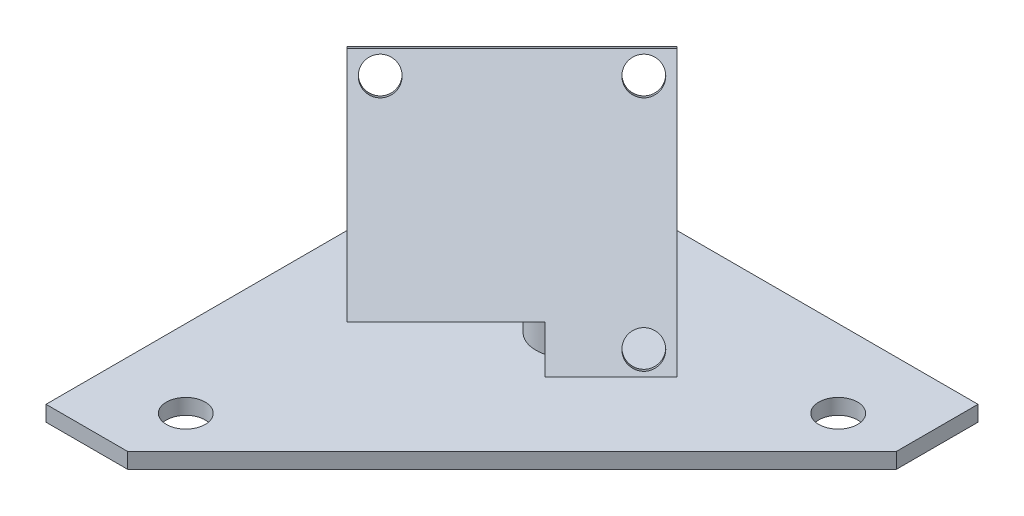
ISO-10303-21;
HEADER;
FILE_DESCRIPTION(('STEP AP214'),'2;1');
FILE_NAME('part.step','',(''),(''),'','','');
FILE_SCHEMA(('AUTOMOTIVE_DESIGN { 1 0 10303 214 1 1 1 1 }'));
ENDSEC;
DATA;
#1=APPLICATION_CONTEXT('core data for automotive mechanical design processes');
#2=APPLICATION_PROTOCOL_DEFINITION('international standard','automotive_design',2000,#1);
#3=PRODUCT_CONTEXT('',#1,'mechanical');
#4=PRODUCT('Part','Part','',(#3));
#5=PRODUCT_RELATED_PRODUCT_CATEGORY('part','',(#4));
#6=PRODUCT_DEFINITION_FORMATION('','',#4);
#7=PRODUCT_DEFINITION_CONTEXT('part definition',#1,'design');
#8=PRODUCT_DEFINITION('design','',#6,#7);
#9=PRODUCT_DEFINITION_SHAPE('','',#8);
#10=(LENGTH_UNIT() NAMED_UNIT(*) SI_UNIT(.MILLI.,.METRE.));
#11=(NAMED_UNIT(*) PLANE_ANGLE_UNIT() SI_UNIT($,.RADIAN.));
#12=(NAMED_UNIT(*) SI_UNIT($,.STERADIAN.) SOLID_ANGLE_UNIT());
#13=UNCERTAINTY_MEASURE_WITH_UNIT(LENGTH_MEASURE(1.E-05),#10,'distance_accuracy_value','');
#14=(GEOMETRIC_REPRESENTATION_CONTEXT(3) GLOBAL_UNCERTAINTY_ASSIGNED_CONTEXT((#13)) GLOBAL_UNIT_ASSIGNED_CONTEXT((#10,
#11,#12)) REPRESENTATION_CONTEXT('',''));
#15=CARTESIAN_POINT('',(0.,0.,0.));
#16=DIRECTION('',(0.,0.,1.));
#17=DIRECTION('',(1.,0.,0.));
#18=AXIS2_PLACEMENT_3D('',#15,#16,#17);
#19=CARTESIAN_POINT('',(0.,2.,0.));
#20=DIRECTION('',(0.,0.,-1.));
#21=DIRECTION('',(-1.,0.,0.));
#22=AXIS2_PLACEMENT_3D('',#19,#20,#21);
#23=PLANE('',#22);
#24=DIRECTION('',(1.,0.,0.));
#25=VECTOR('',#24,1.);
#26=CARTESIAN_POINT('',(0.,0.,0.));
#27=LINE('',#26,#25);
#28=CARTESIAN_POINT('',(20.,0.,0.));
#29=VERTEX_POINT('',#28);
#30=CARTESIAN_POINT('',(60.,0.,0.));
#31=VERTEX_POINT('',#30);
#32=EDGE_CURVE('E135',#29,#31,#27,.T.);
#33=ORIENTED_EDGE('',*,*,#32,.F.);
#34=DIRECTION('',(0.,-1.,0.));
#35=VECTOR('',#34,1.);
#36=CARTESIAN_POINT('',(20.,2.,0.));
#37=LINE('',#36,#35);
#38=CARTESIAN_POINT('',(20.,2.,0.));
#39=VERTEX_POINT('',#38);
#40=EDGE_CURVE('E11',#39,#29,#37,.T.);
#41=ORIENTED_EDGE('',*,*,#40,.F.);
#42=DIRECTION('',(1.,0.,0.));
#43=VECTOR('',#42,1.);
#44=CARTESIAN_POINT('',(0.,2.,0.));
#45=LINE('',#44,#43);
#46=CARTESIAN_POINT('',(60.,2.,0.));
#47=VERTEX_POINT('',#46);
#48=EDGE_CURVE('E173',#39,#47,#45,.T.);
#49=ORIENTED_EDGE('',*,*,#48,.T.);
#50=DIRECTION('',(0.,-1.,0.));
#51=VECTOR('',#50,1.);
#52=CARTESIAN_POINT('',(60.,2.,0.));
#53=LINE('',#52,#51);
#54=EDGE_CURVE('E52',#47,#31,#53,.T.);
#55=ORIENTED_EDGE('',*,*,#54,.T.);
#56=EDGE_LOOP('',(#33,#41,#49,#55));
#57=FACE_BOUND('',#56,.T.);
#58=ADVANCED_FACE('F35',(#57),#23,.T.);
#59=CARTESIAN_POINT('',(20.,2.,0.));
#60=DIRECTION('',(1.,0.,0.));
#61=DIRECTION('',(0.,0.,-1.));
#62=AXIS2_PLACEMENT_3D('',#59,#60,#61);
#63=PLANE('',#62);
#64=DIRECTION('',(0.,0.,1.));
#65=VECTOR('',#64,1.);
#66=CARTESIAN_POINT('',(20.,0.,0.));
#67=LINE('',#66,#65);
#68=CARTESIAN_POINT('',(20.,0.,20.));
#69=VERTEX_POINT('',#68);
#70=EDGE_CURVE('E137',#29,#69,#67,.T.);
#71=ORIENTED_EDGE('',*,*,#70,.T.);
#72=DIRECTION('',(0.,-1.,0.));
#73=VECTOR('',#72,1.);
#74=CARTESIAN_POINT('',(20.,2.,20.));
#75=LINE('',#74,#73);
#76=CARTESIAN_POINT('',(20.,2.,20.));
#77=VERTEX_POINT('',#76);
#78=EDGE_CURVE('E44',#77,#69,#75,.T.);
#79=ORIENTED_EDGE('',*,*,#78,.F.);
#80=DIRECTION('',(0.,0.,1.));
#81=VECTOR('',#80,1.);
#82=CARTESIAN_POINT('',(20.,2.,0.));
#83=LINE('',#82,#81);
#84=EDGE_CURVE('E171',#39,#77,#83,.T.);
#85=ORIENTED_EDGE('',*,*,#84,.F.);
#86=ORIENTED_EDGE('',*,*,#40,.T.);
#87=EDGE_LOOP('',(#71,#79,#85,#86));
#88=FACE_BOUND('',#87,.T.);
#89=ADVANCED_FACE('F165',(#88),#63,.F.);
#90=CARTESIAN_POINT('',(0.,2.,20.));
#91=DIRECTION('',(0.,0.,-1.));
#92=DIRECTION('',(-1.,0.,0.));
#93=AXIS2_PLACEMENT_3D('',#90,#91,#92);
#94=PLANE('',#93);
#95=DIRECTION('',(1.,0.,0.));
#96=VECTOR('',#95,1.);
#97=CARTESIAN_POINT('',(0.,0.,20.));
#98=LINE('',#97,#96);
#99=CARTESIAN_POINT('',(0.,0.,20.));
#100=VERTEX_POINT('',#99);
#101=EDGE_CURVE('E140',#100,#69,#98,.T.);
#102=ORIENTED_EDGE('',*,*,#101,.F.);
#103=DIRECTION('',(0.,-1.,0.));
#104=VECTOR('',#103,1.);
#105=CARTESIAN_POINT('',(0.,2.,20.));
#106=LINE('',#105,#104);
#107=CARTESIAN_POINT('',(0.,2.,20.));
#108=VERTEX_POINT('',#107);
#109=EDGE_CURVE('E156',#108,#100,#106,.T.);
#110=ORIENTED_EDGE('',*,*,#109,.F.);
#111=DIRECTION('',(1.,0.,0.));
#112=VECTOR('',#111,1.);
#113=CARTESIAN_POINT('',(0.,2.,20.));
#114=LINE('',#113,#112);
#115=EDGE_CURVE('E162',#108,#77,#114,.T.);
#116=ORIENTED_EDGE('',*,*,#115,.T.);
#117=ORIENTED_EDGE('',*,*,#78,.T.);
#118=EDGE_LOOP('',(#102,#110,#116,#117));
#119=FACE_BOUND('',#118,.T.);
#120=ADVANCED_FACE('F161',(#119),#94,.T.);
#121=CARTESIAN_POINT('',(0.,2.,0.));
#122=DIRECTION('',(1.,0.,0.));
#123=DIRECTION('',(0.,0.,-1.));
#124=AXIS2_PLACEMENT_3D('',#121,#122,#123);
#125=PLANE('',#124);
#126=DIRECTION('',(0.,0.,1.));
#127=VECTOR('',#126,1.);
#128=CARTESIAN_POINT('',(0.,0.,0.));
#129=LINE('',#128,#127);
#130=CARTESIAN_POINT('',(0.,0.,60.));
#131=VERTEX_POINT('',#130);
#132=EDGE_CURVE('E143',#100,#131,#129,.T.);
#133=ORIENTED_EDGE('',*,*,#132,.T.);
#134=DIRECTION('',(0.,-1.,0.));
#135=VECTOR('',#134,1.);
#136=CARTESIAN_POINT('',(0.,2.,60.));
#137=LINE('',#136,#135);
#138=CARTESIAN_POINT('',(0.,2.,60.));
#139=VERTEX_POINT('',#138);
#140=EDGE_CURVE('E120',#139,#131,#137,.T.);
#141=ORIENTED_EDGE('',*,*,#140,.F.);
#142=DIRECTION('',(0.,0.,1.));
#143=VECTOR('',#142,1.);
#144=CARTESIAN_POINT('',(0.,2.,0.));
#145=LINE('',#144,#143);
#146=EDGE_CURVE('E109',#108,#139,#145,.T.);
#147=ORIENTED_EDGE('',*,*,#146,.F.);
#148=ORIENTED_EDGE('',*,*,#109,.T.);
#149=EDGE_LOOP('',(#133,#141,#147,#148));
#150=FACE_BOUND('',#149,.T.);
#151=ADVANCED_FACE('F170',(#150),#125,.F.);
#152=CARTESIAN_POINT('',(0.,2.,60.));
#153=DIRECTION('',(0.,0.,-1.));
#154=DIRECTION('',(-1.,0.,0.));
#155=AXIS2_PLACEMENT_3D('',#152,#153,#154);
#156=PLANE('',#155);
#157=DIRECTION('',(1.,0.,0.));
#158=VECTOR('',#157,1.);
#159=CARTESIAN_POINT('',(0.,0.,60.));
#160=LINE('',#159,#158);
#161=CARTESIAN_POINT('',(10.5025253169417,0.,60.));
#162=VERTEX_POINT('',#161);
#163=EDGE_CURVE('E117',#131,#162,#160,.T.);
#164=ORIENTED_EDGE('',*,*,#163,.T.);
#165=DIRECTION('',(0.,-1.,0.));
#166=VECTOR('',#165,1.);
#167=CARTESIAN_POINT('',(10.5025253169417,2.,60.));
#168=LINE('',#167,#166);
#169=CARTESIAN_POINT('',(10.5025253169417,2.,60.));
#170=VERTEX_POINT('',#169);
#171=EDGE_CURVE('E115',#170,#162,#168,.T.);
#172=ORIENTED_EDGE('',*,*,#171,.F.);
#173=DIRECTION('',(1.,0.,0.));
#174=VECTOR('',#173,1.);
#175=CARTESIAN_POINT('',(0.,2.,60.));
#176=LINE('',#175,#174);
#177=EDGE_CURVE('E100',#139,#170,#176,.T.);
#178=ORIENTED_EDGE('',*,*,#177,.F.);
#179=ORIENTED_EDGE('',*,*,#140,.T.);
#180=EDGE_LOOP('',(#164,#172,#178,#179));
#181=FACE_BOUND('',#180,.T.);
#182=ADVANCED_FACE('F116',(#181),#156,.F.);
#183=CARTESIAN_POINT('',(35.2512626584708,2.,35.2512626584708));
#184=DIRECTION('',(0.707106781186547,0.,0.707106781186547));
#185=DIRECTION('',(0.707106781186548,0.,-0.707106781186548));
#186=AXIS2_PLACEMENT_3D('',#183,#184,#185);
#187=PLANE('',#186);
#188=DIRECTION('',(-0.707106781186548,0.,0.707106781186548));
#189=VECTOR('',#188,1.);
#190=CARTESIAN_POINT('',(35.2512626584708,0.,35.2512626584708));
#191=LINE('',#190,#189);
#192=CARTESIAN_POINT('',(60.,0.,10.5025253169417));
#193=VERTEX_POINT('',#192);
#194=EDGE_CURVE('E147',#193,#162,#191,.T.);
#195=ORIENTED_EDGE('',*,*,#194,.F.);
#196=DIRECTION('',(0.,-1.,0.));
#197=VECTOR('',#196,1.);
#198=CARTESIAN_POINT('',(60.,2.,10.5025253169417));
#199=LINE('',#198,#197);
#200=CARTESIAN_POINT('',(60.,2.,10.5025253169417));
#201=VERTEX_POINT('',#200);
#202=EDGE_CURVE('E75',#201,#193,#199,.T.);
#203=ORIENTED_EDGE('',*,*,#202,.F.);
#204=DIRECTION('',(-0.707106781186548,0.,0.707106781186548));
#205=VECTOR('',#204,1.);
#206=CARTESIAN_POINT('',(35.2512626584708,2.,35.2512626584708));
#207=LINE('',#206,#205);
#208=EDGE_CURVE('E106',#201,#170,#207,.T.);
#209=ORIENTED_EDGE('',*,*,#208,.T.);
#210=ORIENTED_EDGE('',*,*,#171,.T.);
#211=EDGE_LOOP('',(#195,#203,#209,#210));
#212=FACE_BOUND('',#211,.T.);
#213=ADVANCED_FACE('F122',(#212),#187,.T.);
#214=CARTESIAN_POINT('',(10.,2.,52.));
#215=DIRECTION('',(0.,-1.,0.));
#216=DIRECTION('',(0.,0.,-1.));
#217=AXIS2_PLACEMENT_3D('',#214,#215,#216);
#218=CYLINDRICAL_SURFACE('',#217,2.5);
#219=CARTESIAN_POINT('',(10.,2.,52.));
#220=DIRECTION('',(0.,1.,0.));
#221=DIRECTION('',(0.,0.,1.));
#222=AXIS2_PLACEMENT_3D('',#219,#220,#221);
#223=CIRCLE('',#222,2.5);
#224=CARTESIAN_POINT('',(10.,2.,54.5));
#225=VERTEX_POINT('',#224);
#226=EDGE_CURVE('E177',#225,#225,#223,.T.);
#227=ORIENTED_EDGE('',*,*,#226,.T.);
#228=EDGE_LOOP('',(#227));
#229=FACE_BOUND('',#228,.T.);
#230=CARTESIAN_POINT('',(10.,0.,52.));
#231=DIRECTION('',(0.,1.,0.));
#232=DIRECTION('',(0.,0.,1.));
#233=AXIS2_PLACEMENT_3D('',#230,#231,#232);
#234=CIRCLE('',#233,2.5);
#235=CARTESIAN_POINT('',(10.,0.,54.5));
#236=VERTEX_POINT('',#235);
#237=EDGE_CURVE('E131',#236,#236,#234,.T.);
#238=ORIENTED_EDGE('',*,*,#237,.F.);
#239=EDGE_LOOP('',(#238));
#240=FACE_BOUND('',#239,.T.);
#241=ADVANCED_FACE('F295',(#229,#240),#218,.F.);
#242=CARTESIAN_POINT('',(52.,2.,10.));
#243=DIRECTION('',(0.,-1.,0.));
#244=DIRECTION('',(0.,0.,-1.));
#245=AXIS2_PLACEMENT_3D('',#242,#243,#244);
#246=CYLINDRICAL_SURFACE('',#245,2.5);
#247=CARTESIAN_POINT('',(52.,2.,10.));
#248=DIRECTION('',(0.,1.,0.));
#249=DIRECTION('',(0.,0.,1.));
#250=AXIS2_PLACEMENT_3D('',#247,#248,#249);
#251=CIRCLE('',#250,2.5);
#252=CARTESIAN_POINT('',(52.,2.,12.5));
#253=VERTEX_POINT('',#252);
#254=EDGE_CURVE('E152',#253,#253,#251,.T.);
#255=ORIENTED_EDGE('',*,*,#254,.T.);
#256=EDGE_LOOP('',(#255));
#257=FACE_BOUND('',#256,.T.);
#258=CARTESIAN_POINT('',(52.,0.,10.));
#259=DIRECTION('',(0.,1.,0.));
#260=DIRECTION('',(0.,0.,1.));
#261=AXIS2_PLACEMENT_3D('',#258,#259,#260);
#262=CIRCLE('',#261,2.5);
#263=CARTESIAN_POINT('',(52.,0.,12.5));
#264=VERTEX_POINT('',#263);
#265=EDGE_CURVE('E128',#264,#264,#262,.T.);
#266=ORIENTED_EDGE('',*,*,#265,.F.);
#267=EDGE_LOOP('',(#266));
#268=FACE_BOUND('',#267,.T.);
#269=ADVANCED_FACE('F37',(#257,#268),#246,.F.);
#270=CARTESIAN_POINT('',(60.,2.,0.));
#271=DIRECTION('',(1.,0.,0.));
#272=DIRECTION('',(0.,0.,-1.));
#273=AXIS2_PLACEMENT_3D('',#270,#271,#272);
#274=PLANE('',#273);
#275=DIRECTION('',(0.,0.,1.));
#276=VECTOR('',#275,1.);
#277=CARTESIAN_POINT('',(60.,0.,0.));
#278=LINE('',#277,#276);
#279=EDGE_CURVE('E149',#31,#193,#278,.T.);
#280=ORIENTED_EDGE('',*,*,#279,.F.);
#281=ORIENTED_EDGE('',*,*,#54,.F.);
#282=DIRECTION('',(0.,0.,1.));
#283=VECTOR('',#282,1.);
#284=CARTESIAN_POINT('',(60.,2.,0.));
#285=LINE('',#284,#283);
#286=EDGE_CURVE('E123',#47,#201,#285,.T.);
#287=ORIENTED_EDGE('',*,*,#286,.T.);
#288=ORIENTED_EDGE('',*,*,#202,.T.);
#289=EDGE_LOOP('',(#280,#281,#287,#288));
#290=FACE_BOUND('',#289,.T.);
#291=ADVANCED_FACE('F302',(#290),#274,.T.);
#292=CARTESIAN_POINT('',(0.,2.,0.));
#293=DIRECTION('',(0.,1.,0.));
#294=DIRECTION('',(0.,0.,1.));
#295=AXIS2_PLACEMENT_3D('',#292,#293,#294);
#296=PLANE('',#295);
#297=CARTESIAN_POINT('',(25.5115964232404,2.,18.4405286113749));
#298=DIRECTION('',(0.,1.,0.));
#299=DIRECTION('',(0.,0.,1.));
#300=AXIS2_PLACEMENT_3D('',#297,#298,#299);
#301=CIRCLE('',#300,4.);
#302=CARTESIAN_POINT('',(25.5115964232404,2.,22.4405286113749));
#303=VERTEX_POINT('',#302);
#304=EDGE_CURVE('E184',#303,#303,#301,.T.);
#305=ORIENTED_EDGE('',*,*,#304,.F.);
#306=EDGE_LOOP('',(#305));
#307=FACE_BOUND('',#306,.T.);
#308=ORIENTED_EDGE('',*,*,#254,.F.);
#309=EDGE_LOOP('',(#308));
#310=FACE_BOUND('',#309,.T.);
#311=ORIENTED_EDGE('',*,*,#226,.F.);
#312=EDGE_LOOP('',(#311));
#313=FACE_BOUND('',#312,.T.);
#314=ORIENTED_EDGE('',*,*,#48,.F.);
#315=ORIENTED_EDGE('',*,*,#84,.T.);
#316=ORIENTED_EDGE('',*,*,#115,.F.);
#317=ORIENTED_EDGE('',*,*,#146,.T.);
#318=ORIENTED_EDGE('',*,*,#177,.T.);
#319=ORIENTED_EDGE('',*,*,#208,.F.);
#320=ORIENTED_EDGE('',*,*,#286,.F.);
#321=EDGE_LOOP('',(#314,#315,#316,#317,#318,#319,#320));
#322=FACE_BOUND('',#321,.T.);
#323=ADVANCED_FACE('F103',(#307,#310,#313,#322),#296,.T.);
#324=CARTESIAN_POINT('',(0.,0.,0.));
#325=DIRECTION('',(0.,1.,0.));
#326=DIRECTION('',(0.,0.,1.));
#327=AXIS2_PLACEMENT_3D('',#324,#325,#326);
#328=PLANE('',#327);
#329=ORIENTED_EDGE('',*,*,#265,.T.);
#330=EDGE_LOOP('',(#329));
#331=FACE_BOUND('',#330,.T.);
#332=ORIENTED_EDGE('',*,*,#237,.T.);
#333=EDGE_LOOP('',(#332));
#334=FACE_BOUND('',#333,.T.);
#335=ORIENTED_EDGE('',*,*,#32,.T.);
#336=ORIENTED_EDGE('',*,*,#279,.T.);
#337=ORIENTED_EDGE('',*,*,#194,.T.);
#338=ORIENTED_EDGE('',*,*,#163,.F.);
#339=ORIENTED_EDGE('',*,*,#132,.F.);
#340=ORIENTED_EDGE('',*,*,#101,.T.);
#341=ORIENTED_EDGE('',*,*,#70,.F.);
#342=EDGE_LOOP('',(#335,#336,#337,#338,#339,#340,#341));
#343=FACE_BOUND('',#342,.T.);
#344=ADVANCED_FACE('F168',(#331,#334,#343),#328,.F.);
#345=CARTESIAN_POINT('',(25.5115964232404,38.6251153090657,18.4405286113749));
#346=DIRECTION('',(0.,-1.,0.));
#347=DIRECTION('',(0.,0.,-1.));
#348=AXIS2_PLACEMENT_3D('',#345,#346,#347);
#349=CYLINDRICAL_SURFACE('',#348,4.);
#350=ORIENTED_EDGE('',*,*,#304,.T.);
#351=EDGE_LOOP('',(#350));
#352=FACE_BOUND('',#351,.T.);
#353=CARTESIAN_POINT('',(25.5115964232404,21.6545525605885,18.4405286113749));
#354=DIRECTION('',(0.612372435695795,0.499999999999998,0.612372435695795));
#355=DIRECTION('',(0.353553390593273,-0.86602540378444,0.353553390593272));
#356=AXIS2_PLACEMENT_3D('',#353,#354,#355);
#357=ELLIPSE('',#356,8.00000000000004,4.);
#358=CARTESIAN_POINT('',(28.3400235479866,14.726349330313,21.2689557361211));
#359=VERTEX_POINT('',#358);
#360=EDGE_CURVE('E132',#359,#359,#357,.T.);
#361=ORIENTED_EDGE('',*,*,#360,.F.);
#362=EDGE_LOOP('',(#361));
#363=FACE_BOUND('',#362,.T.);
#364=ADVANCED_FACE('F310',(#352,#363),#349,.T.);
#365=CARTESIAN_POINT('',(26.4584376506471,19.8711730708738,22.2157969635278));
#366=DIRECTION('',(-0.707106781186547,0.,0.707106781186547));
#367=DIRECTION('',(0.707106781186548,0.,0.707106781186548));
#368=AXIS2_PLACEMENT_3D('',#365,#366,#367);
#369=PLANE('',#368);
#370=DIRECTION('',(-0.353553390593272,0.86602540378444,-0.353553390593272));
#371=VECTOR('',#370,1.);
#372=CARTESIAN_POINT('',(25.2336927792555,18.8711730708738,20.9910520921362));
#373=LINE('',#372,#371);
#374=CARTESIAN_POINT('',(31.1684506727327,4.33404448489977,26.9258099856134));
#375=VERTEX_POINT('',#374);
#376=CARTESIAN_POINT('',(29.4006837197664,8.66417150382197,25.1580430326471));
#377=VERTEX_POINT('',#376);
#378=EDGE_CURVE('E228',#375,#377,#373,.T.);
#379=ORIENTED_EDGE('',*,*,#378,.F.);
#380=DIRECTION('',(-0.612372435695795,-0.499999999999998,-0.612372435695795));
#381=VECTOR('',#380,1.);
#382=CARTESIAN_POINT('',(32.3931955441243,5.33404448489977,28.150554857005));
#383=LINE('',#382,#381);
#384=CARTESIAN_POINT('',(32.3931955441243,5.33404448489977,28.150554857005));
#385=VERTEX_POINT('',#384);
#386=EDGE_CURVE('E187',#385,#375,#383,.T.);
#387=ORIENTED_EDGE('',*,*,#386,.F.);
#388=DIRECTION('',(-0.353553390593272,0.86602540378444,-0.353553390593272));
#389=VECTOR('',#388,1.);
#390=CARTESIAN_POINT('',(26.4584376506471,19.8711730708738,22.2157969635278));
#391=LINE('',#390,#389);
#392=CARTESIAN_POINT('',(30.625428591158,9.66417150382197,26.3827879040387));
#393=VERTEX_POINT('',#392);
#394=EDGE_CURVE('E254',#385,#393,#391,.T.);
#395=ORIENTED_EDGE('',*,*,#394,.T.);
#396=DIRECTION('',(-0.612372435695795,-0.499999999999998,-0.612372435695795));
#397=VECTOR('',#396,1.);
#398=CARTESIAN_POINT('',(30.625428591158,9.66417150382197,26.3827879040387));
#399=LINE('',#398,#397);
#400=EDGE_CURVE('E202',#393,#377,#399,.T.);
#401=ORIENTED_EDGE('',*,*,#400,.T.);
#402=EDGE_LOOP('',(#379,#387,#395,#401));
#403=FACE_BOUND('',#402,.T.);
#404=ADVANCED_FACE('F317',(#403),#369,.T.);
#405=CARTESIAN_POINT('',(30.2718752005647,5.33404448489977,30.2718752005647));
#406=DIRECTION('',(0.353553390593272,-0.86602540378444,0.353553390593273));
#407=DIRECTION('',(0.,-0.377964473009226,-0.925820099772552));
#408=AXIS2_PLACEMENT_3D('',#405,#406,#407);
#409=PLANE('',#408);
#410=DIRECTION('',(-0.707106781186548,0.,0.707106781186548));
#411=VECTOR('',#410,1.);
#412=CARTESIAN_POINT('',(29.0471303291731,4.33404448489977,29.0471303291731));
#413=LINE('',#412,#411);
#414=CARTESIAN_POINT('',(39.6537320469713,4.33404448489977,18.4405286113749));
#415=VERTEX_POINT('',#414);
#416=EDGE_CURVE('E225',#415,#375,#413,.T.);
#417=ORIENTED_EDGE('',*,*,#416,.F.);
#418=DIRECTION('',(-0.612372435695795,-0.499999999999998,-0.612372435695795));
#419=VECTOR('',#418,1.);
#420=CARTESIAN_POINT('',(40.8784769183629,5.33404448489976,19.6652734827664));
#421=LINE('',#420,#419);
#422=CARTESIAN_POINT('',(40.8784769183629,5.33404448489976,19.6652734827664));
#423=VERTEX_POINT('',#422);
#424=EDGE_CURVE('E190',#423,#415,#421,.T.);
#425=ORIENTED_EDGE('',*,*,#424,.F.);
#426=DIRECTION('',(-0.707106781186548,0.,0.707106781186548));
#427=VECTOR('',#426,1.);
#428=CARTESIAN_POINT('',(30.2718752005647,5.33404448489977,30.2718752005647));
#429=LINE('',#428,#427);
#430=EDGE_CURVE('E251',#423,#385,#429,.T.);
#431=ORIENTED_EDGE('',*,*,#430,.T.);
#432=ORIENTED_EDGE('',*,*,#386,.T.);
#433=EDGE_LOOP('',(#417,#425,#431,#432));
#434=FACE_BOUND('',#433,.T.);
#435=ADVANCED_FACE('F387',(#434),#409,.T.);
#436=CARTESIAN_POINT('',(34.9437190248857,19.8711730708738,13.7305155892892));
#437=DIRECTION('',(-0.707106781186547,0.,0.707106781186548));
#438=DIRECTION('',(0.707106781186548,0.,0.707106781186547));
#439=AXIS2_PLACEMENT_3D('',#436,#437,#438);
#440=PLANE('',#439);
#441=DIRECTION('',(-0.353553390593273,0.86602540378444,-0.353553390593272));
#442=VECTOR('',#441,1.);
#443=CARTESIAN_POINT('',(33.7189741534941,18.8711730708738,12.5057707178976));
#444=LINE('',#443,#442);
#445=CARTESIAN_POINT('',(29.0471303291731,30.314806598433,7.83392689357668));
#446=VERTEX_POINT('',#445);
#447=EDGE_CURVE('E222',#415,#446,#444,.T.);
#448=ORIENTED_EDGE('',*,*,#447,.T.);
#449=DIRECTION('',(-0.612372435695795,-0.499999999999998,-0.612372435695795));
#450=VECTOR('',#449,1.);
#451=CARTESIAN_POINT('',(30.2718752005647,31.314806598433,9.05867176496827));
#452=LINE('',#451,#450);
#453=CARTESIAN_POINT('',(30.2718752005647,31.314806598433,9.05867176496827));
#454=VERTEX_POINT('',#453);
#455=EDGE_CURVE('E193',#454,#446,#452,.T.);
#456=ORIENTED_EDGE('',*,*,#455,.F.);
#457=DIRECTION('',(-0.353553390593273,0.86602540378444,-0.353553390593272));
#458=VECTOR('',#457,1.);
#459=CARTESIAN_POINT('',(34.9437190248857,19.8711730708738,13.7305155892892));
#460=LINE('',#459,#458);
#461=EDGE_CURVE('E248',#423,#454,#460,.T.);
#462=ORIENTED_EDGE('',*,*,#461,.F.);
#463=ORIENTED_EDGE('',*,*,#424,.T.);
#464=EDGE_LOOP('',(#448,#456,#462,#463));
#465=FACE_BOUND('',#464,.T.);
#466=ADVANCED_FACE('F397',(#465),#440,.F.);
#467=CARTESIAN_POINT('',(19.6652734827665,31.314806598433,19.6652734827665));
#468=DIRECTION('',(0.353553390593272,-0.86602540378444,0.353553390593272));
#469=DIRECTION('',(0.925820099772552,0.377964473009226,0.));
#470=AXIS2_PLACEMENT_3D('',#467,#468,#469);
#471=PLANE('',#470);
#472=DIRECTION('',(-0.707106781186547,0.,0.707106781186548));
#473=VECTOR('',#472,1.);
#474=CARTESIAN_POINT('',(18.4405286113749,30.314806598433,18.4405286113749));
#475=LINE('',#474,#473);
#476=CARTESIAN_POINT('',(7.83392689357669,30.314806598433,29.0471303291731));
#477=VERTEX_POINT('',#476);
#478=EDGE_CURVE('E219',#446,#477,#475,.T.);
#479=ORIENTED_EDGE('',*,*,#478,.T.);
#480=DIRECTION('',(-0.612372435695795,-0.499999999999998,-0.612372435695795));
#481=VECTOR('',#480,1.);
#482=CARTESIAN_POINT('',(9.05867176496828,31.314806598433,30.2718752005647));
#483=LINE('',#482,#481);
#484=CARTESIAN_POINT('',(9.05867176496828,31.314806598433,30.2718752005647));
#485=VERTEX_POINT('',#484);
#486=EDGE_CURVE('E196',#485,#477,#483,.T.);
#487=ORIENTED_EDGE('',*,*,#486,.F.);
#488=DIRECTION('',(-0.707106781186547,0.,0.707106781186548));
#489=VECTOR('',#488,1.);
#490=CARTESIAN_POINT('',(19.6652734827665,31.314806598433,19.6652734827665));
#491=LINE('',#490,#489);
#492=EDGE_CURVE('E245',#454,#485,#491,.T.);
#493=ORIENTED_EDGE('',*,*,#492,.F.);
#494=ORIENTED_EDGE('',*,*,#455,.T.);
#495=EDGE_LOOP('',(#479,#487,#493,#494));
#496=FACE_BOUND('',#495,.T.);
#497=ADVANCED_FACE('F407',(#496),#471,.F.);
#498=CARTESIAN_POINT('',(13.7305155892892,19.8711730708738,34.9437190248857));
#499=DIRECTION('',(-0.707106781186547,0.,0.707106781186548));
#500=DIRECTION('',(0.707106781186548,0.,0.707106781186547));
#501=AXIS2_PLACEMENT_3D('',#498,#499,#500);
#502=PLANE('',#501);
#503=DIRECTION('',(-0.353553390593273,0.86602540378444,-0.353553390593272));
#504=VECTOR('',#503,1.);
#505=CARTESIAN_POINT('',(12.5057707178976,18.8711730708738,33.7189741534941));
#506=LINE('',#505,#504);
#507=CARTESIAN_POINT('',(16.6727616584085,8.66417150382196,37.8859650940049));
#508=VERTEX_POINT('',#507);
#509=EDGE_CURVE('E216',#508,#477,#506,.T.);
#510=ORIENTED_EDGE('',*,*,#509,.F.);
#511=DIRECTION('',(-0.612372435695795,-0.499999999999998,-0.612372435695795));
#512=VECTOR('',#511,1.);
#513=CARTESIAN_POINT('',(17.8975065298001,9.66417150382196,39.1107099653965));
#514=LINE('',#513,#512);
#515=CARTESIAN_POINT('',(17.8975065298001,9.66417150382196,39.1107099653965));
#516=VERTEX_POINT('',#515);
#517=EDGE_CURVE('E199',#516,#508,#514,.T.);
#518=ORIENTED_EDGE('',*,*,#517,.F.);
#519=DIRECTION('',(-0.353553390593273,0.86602540378444,-0.353553390593272));
#520=VECTOR('',#519,1.);
#521=CARTESIAN_POINT('',(13.7305155892892,19.8711730708738,34.9437190248857));
#522=LINE('',#521,#520);
#523=EDGE_CURVE('E242',#516,#485,#522,.T.);
#524=ORIENTED_EDGE('',*,*,#523,.T.);
#525=ORIENTED_EDGE('',*,*,#486,.T.);
#526=EDGE_LOOP('',(#510,#518,#524,#525));
#527=FACE_BOUND('',#526,.T.);
#528=ADVANCED_FACE('F417',(#527),#502,.T.);
#529=CARTESIAN_POINT('',(12.0638755850111,29.1497430889719,29.0344383334882));
#530=DIRECTION('',(-0.612372435695795,-0.499999999999998,-0.612372435695795));
#531=DIRECTION('',(-0.707106781186547,0.,0.707106781186548));
#532=AXIS2_PLACEMENT_3D('',#529,#530,#531);
#533=CYLINDRICAL_SURFACE('',#532,2.);
#534=CARTESIAN_POINT('',(12.0638755850111,29.1497430889719,29.0344383334882));
#535=DIRECTION('',(0.612372435695795,0.499999999999998,0.612372435695795));
#536=DIRECTION('',(0.707106781186547,0.,-0.707106781186548));
#537=AXIS2_PLACEMENT_3D('',#534,#535,#536);
#538=CIRCLE('',#537,2.);
#539=CARTESIAN_POINT('',(13.4780891473842,29.1497430889719,27.6202247711152));
#540=VERTEX_POINT('',#539);
#541=EDGE_CURVE('E236',#540,#540,#538,.T.);
#542=ORIENTED_EDGE('',*,*,#541,.T.);
#543=EDGE_LOOP('',(#542));
#544=FACE_BOUND('',#543,.T.);
#545=CARTESIAN_POINT('',(10.8391307136195,28.1497430889719,27.8096934620967));
#546=DIRECTION('',(0.612372435695795,0.499999999999998,0.612372435695795));
#547=DIRECTION('',(0.707106781186547,0.,-0.707106781186548));
#548=AXIS2_PLACEMENT_3D('',#545,#546,#547);
#549=CIRCLE('',#548,2.);
#550=CARTESIAN_POINT('',(12.2533442759926,28.1497430889719,26.3954798997236));
#551=VERTEX_POINT('',#550);
#552=EDGE_CURVE('E210',#551,#551,#549,.T.);
#553=ORIENTED_EDGE('',*,*,#552,.F.);
#554=EDGE_LOOP('',(#553));
#555=FACE_BOUND('',#554,.T.);
#556=ADVANCED_FACE('F427',(#544,#555),#533,.F.);
#557=CARTESIAN_POINT('',(28.5041082475983,9.66417150382197,28.5041082475983));
#558=DIRECTION('',(-0.353553390593273,0.86602540378444,-0.353553390593272));
#559=DIRECTION('',(-0.925820099772552,-0.377964473009226,0.));
#560=AXIS2_PLACEMENT_3D('',#557,#558,#559);
#561=PLANE('',#560);
#562=DIRECTION('',(0.707106781186547,0.,-0.707106781186548));
#563=VECTOR('',#562,1.);
#564=CARTESIAN_POINT('',(27.2793633762067,8.66417150382197,27.2793633762067));
#565=LINE('',#564,#563);
#566=EDGE_CURVE('E213',#508,#377,#565,.T.);
#567=ORIENTED_EDGE('',*,*,#566,.T.);
#568=ORIENTED_EDGE('',*,*,#400,.F.);
#569=DIRECTION('',(0.707106781186547,0.,-0.707106781186548));
#570=VECTOR('',#569,1.);
#571=CARTESIAN_POINT('',(28.5041082475983,9.66417150382197,28.5041082475983));
#572=LINE('',#571,#570);
#573=EDGE_CURVE('E239',#516,#393,#572,.T.);
#574=ORIENTED_EDGE('',*,*,#573,.F.);
#575=ORIENTED_EDGE('',*,*,#517,.T.);
#576=EDGE_LOOP('',(#567,#568,#574,#575));
#577=FACE_BOUND('',#576,.T.);
#578=ADVANCED_FACE('F437',(#577),#561,.F.);
#579=CARTESIAN_POINT('',(37.8732730983201,7.49910799436087,20.9027103498429));
#580=DIRECTION('',(-0.612372435695795,-0.499999999999998,-0.612372435695795));
#581=DIRECTION('',(-0.707106781186547,0.,0.707106781186548));
#582=AXIS2_PLACEMENT_3D('',#579,#580,#581);
#583=CYLINDRICAL_SURFACE('',#582,2.);
#584=CARTESIAN_POINT('',(37.8732730983201,7.49910799436087,20.9027103498429));
#585=DIRECTION('',(0.612372435695795,0.499999999999998,0.612372435695795));
#586=DIRECTION('',(0.707106781186547,0.,-0.707106781186548));
#587=AXIS2_PLACEMENT_3D('',#584,#585,#586);
#588=CIRCLE('',#587,2.);
#589=CARTESIAN_POINT('',(39.2874866606931,7.49910799436087,19.4884967874698));
#590=VERTEX_POINT('',#589);
#591=EDGE_CURVE('E209',#590,#590,#588,.T.);
#592=ORIENTED_EDGE('',*,*,#591,.T.);
#593=EDGE_LOOP('',(#592));
#594=FACE_BOUND('',#593,.T.);
#595=CARTESIAN_POINT('',(36.6485282269285,6.49910799436087,19.6779654784513));
#596=DIRECTION('',(0.612372435695795,0.499999999999998,0.612372435695795));
#597=DIRECTION('',(0.707106781186547,0.,-0.707106781186548));
#598=AXIS2_PLACEMENT_3D('',#595,#596,#597);
#599=CIRCLE('',#598,2.);
#600=CARTESIAN_POINT('',(38.0627417893016,6.49910799436087,18.2637519160782));
#601=VERTEX_POINT('',#600);
#602=EDGE_CURVE('E231',#601,#601,#599,.T.);
#603=ORIENTED_EDGE('',*,*,#602,.F.);
#604=EDGE_LOOP('',(#603));
#605=FACE_BOUND('',#604,.T.);
#606=ADVANCED_FACE('F260',(#594,#605),#583,.F.);
#607=CARTESIAN_POINT('',(29.0344383334882,29.1497430889719,12.0638755850111));
#608=DIRECTION('',(-0.612372435695795,-0.499999999999998,-0.612372435695795));
#609=DIRECTION('',(-0.707106781186547,0.,0.707106781186548));
#610=AXIS2_PLACEMENT_3D('',#607,#608,#609);
#611=CYLINDRICAL_SURFACE('',#610,2.);
#612=CARTESIAN_POINT('',(29.0344383334882,29.1497430889719,12.0638755850111));
#613=DIRECTION('',(0.612372435695795,0.499999999999998,0.612372435695795));
#614=DIRECTION('',(0.707106781186547,0.,-0.707106781186548));
#615=AXIS2_PLACEMENT_3D('',#612,#613,#614);
#616=CIRCLE('',#615,2.);
#617=CARTESIAN_POINT('',(30.4486518958613,29.1497430889719,10.649662022638));
#618=VERTEX_POINT('',#617);
#619=EDGE_CURVE('E205',#618,#618,#616,.F.);
#620=ORIENTED_EDGE('',*,*,#619,.F.);
#621=EDGE_LOOP('',(#620));
#622=FACE_BOUND('',#621,.T.);
#623=CARTESIAN_POINT('',(27.8096934620967,28.1497430889719,10.8391307136195));
#624=DIRECTION('',(0.612372435695795,0.499999999999998,0.612372435695795));
#625=DIRECTION('',(0.707106781186547,0.,-0.707106781186548));
#626=AXIS2_PLACEMENT_3D('',#623,#624,#625);
#627=CIRCLE('',#626,2.);
#628=CARTESIAN_POINT('',(29.2239070244697,28.1497430889719,9.42491715124641));
#629=VERTEX_POINT('',#628);
#630=EDGE_CURVE('E206',#629,#629,#627,.F.);
#631=ORIENTED_EDGE('',*,*,#630,.T.);
#632=EDGE_LOOP('',(#631));
#633=FACE_BOUND('',#632,.T.);
#634=ADVANCED_FACE('F267',(#622,#633),#611,.F.);
#635=CARTESIAN_POINT('',(24.3371173070874,19.8711730708738,24.3371173070874));
#636=DIRECTION('',(0.612372435695795,0.499999999999998,0.612372435695795));
#637=DIRECTION('',(0.707106781186547,0.,-0.707106781186548));
#638=AXIS2_PLACEMENT_3D('',#635,#636,#637);
#639=PLANE('',#638);
#640=ORIENTED_EDGE('',*,*,#591,.F.);
#641=EDGE_LOOP('',(#640));
#642=FACE_BOUND('',#641,.T.);
#643=ORIENTED_EDGE('',*,*,#394,.F.);
#644=ORIENTED_EDGE('',*,*,#430,.F.);
#645=ORIENTED_EDGE('',*,*,#461,.T.);
#646=ORIENTED_EDGE('',*,*,#492,.T.);
#647=ORIENTED_EDGE('',*,*,#523,.F.);
#648=ORIENTED_EDGE('',*,*,#573,.T.);
#649=EDGE_LOOP('',(#643,#644,#645,#646,#647,#648));
#650=FACE_BOUND('',#649,.T.);
#651=ORIENTED_EDGE('',*,*,#541,.F.);
#652=EDGE_LOOP('',(#651));
#653=FACE_BOUND('',#652,.T.);
#654=ORIENTED_EDGE('',*,*,#619,.T.);
#655=EDGE_LOOP('',(#654));
#656=FACE_BOUND('',#655,.T.);
#657=ADVANCED_FACE('F263',(#642,#650,#653,#656),#639,.T.);
#658=CARTESIAN_POINT('',(23.1123724356959,18.8711730708738,23.1123724356959));
#659=DIRECTION('',(0.612372435695795,0.499999999999998,0.612372435695795));
#660=DIRECTION('',(0.707106781186547,0.,-0.707106781186548));
#661=AXIS2_PLACEMENT_3D('',#658,#659,#660);
#662=PLANE('',#661);
#663=ORIENTED_EDGE('',*,*,#360,.T.);
#664=EDGE_LOOP('',(#663));
#665=FACE_BOUND('',#664,.T.);
#666=ORIENTED_EDGE('',*,*,#602,.T.);
#667=EDGE_LOOP('',(#666));
#668=FACE_BOUND('',#667,.T.);
#669=ORIENTED_EDGE('',*,*,#378,.T.);
#670=ORIENTED_EDGE('',*,*,#566,.F.);
#671=ORIENTED_EDGE('',*,*,#509,.T.);
#672=ORIENTED_EDGE('',*,*,#478,.F.);
#673=ORIENTED_EDGE('',*,*,#447,.F.);
#674=ORIENTED_EDGE('',*,*,#416,.T.);
#675=EDGE_LOOP('',(#669,#670,#671,#672,#673,#674));
#676=FACE_BOUND('',#675,.T.);
#677=ORIENTED_EDGE('',*,*,#552,.T.);
#678=EDGE_LOOP('',(#677));
#679=FACE_BOUND('',#678,.T.);
#680=ORIENTED_EDGE('',*,*,#630,.F.);
#681=EDGE_LOOP('',(#680));
#682=FACE_BOUND('',#681,.T.);
#683=ADVANCED_FACE('F266',(#665,#668,#676,#679,#682),#662,.F.);
#684=CLOSED_SHELL('',(#58,#89,#120,#151,#182,#213,#241,#269,#291,#323,#344,#364,#404,#435,#466,
#497,#528,#556,#578,#606,#634,#657,#683));
#685=MANIFOLD_SOLID_BREP('B2',#684);
#686=ADVANCED_BREP_SHAPE_REPRESENTATION('',(#18,#685),#14);
#687=SHAPE_DEFINITION_REPRESENTATION(#9,#686);
ENDSEC;
END-ISO-10303-21;
